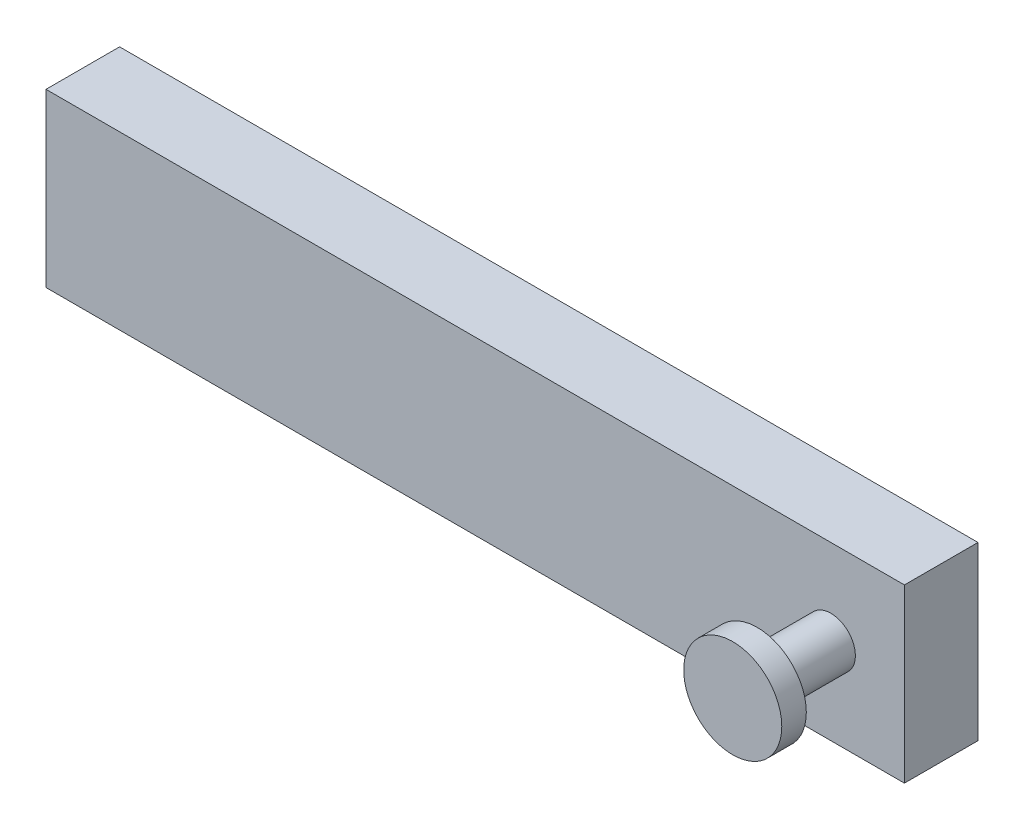
ISO-10303-21;
HEADER;
FILE_DESCRIPTION(('STEP AP214'),'2;1');
FILE_NAME('part.step','',(''),(''),'','','');
FILE_SCHEMA(('AUTOMOTIVE_DESIGN { 1 0 10303 214 1 1 1 1 }'));
ENDSEC;
DATA;
#1=APPLICATION_CONTEXT('core data for automotive mechanical design processes');
#2=APPLICATION_PROTOCOL_DEFINITION('international standard','automotive_design',2000,#1);
#3=PRODUCT_CONTEXT('',#1,'mechanical');
#4=PRODUCT('Part','Part','',(#3));
#5=PRODUCT_RELATED_PRODUCT_CATEGORY('part','',(#4));
#6=PRODUCT_DEFINITION_FORMATION('','',#4);
#7=PRODUCT_DEFINITION_CONTEXT('part definition',#1,'design');
#8=PRODUCT_DEFINITION('design','',#6,#7);
#9=PRODUCT_DEFINITION_SHAPE('','',#8);
#10=(LENGTH_UNIT() NAMED_UNIT(*) SI_UNIT(.MILLI.,.METRE.));
#11=(NAMED_UNIT(*) PLANE_ANGLE_UNIT() SI_UNIT($,.RADIAN.));
#12=(NAMED_UNIT(*) SI_UNIT($,.STERADIAN.) SOLID_ANGLE_UNIT());
#13=UNCERTAINTY_MEASURE_WITH_UNIT(LENGTH_MEASURE(1.E-05),#10,'distance_accuracy_value','');
#14=(GEOMETRIC_REPRESENTATION_CONTEXT(3) GLOBAL_UNCERTAINTY_ASSIGNED_CONTEXT((#13)) GLOBAL_UNIT_ASSIGNED_CONTEXT((#10,
#11,#12)) REPRESENTATION_CONTEXT('',''));
#15=CARTESIAN_POINT('',(0.,0.,0.));
#16=DIRECTION('',(0.,0.,1.));
#17=DIRECTION('',(1.,0.,0.));
#18=AXIS2_PLACEMENT_3D('',#15,#16,#17);
#19=CARTESIAN_POINT('',(0.,70.,30.));
#20=DIRECTION('',(0.,0.,-1.));
#21=DIRECTION('',(-1.,0.,0.));
#22=AXIS2_PLACEMENT_3D('',#19,#20,#21);
#23=PLANE('',#22);
#24=DIRECTION('',(0.,-1.,0.));
#25=VECTOR('',#24,1.);
#26=CARTESIAN_POINT('',(0.,0.,30.));
#27=LINE('',#26,#25);
#28=CARTESIAN_POINT('',(0.,70.,30.));
#29=VERTEX_POINT('',#28);
#30=CARTESIAN_POINT('',(0.,0.,30.));
#31=VERTEX_POINT('',#30);
#32=EDGE_CURVE('E83',#29,#31,#27,.T.);
#33=ORIENTED_EDGE('',*,*,#32,.T.);
#34=DIRECTION('',(1.,0.,0.));
#35=VECTOR('',#34,1.);
#36=CARTESIAN_POINT('',(0.,0.,30.));
#37=LINE('',#36,#35);
#38=CARTESIAN_POINT('',(350.,0.,30.));
#39=VERTEX_POINT('',#38);
#40=EDGE_CURVE('E78',#31,#39,#37,.T.);
#41=ORIENTED_EDGE('',*,*,#40,.T.);
#42=DIRECTION('',(0.,1.,0.));
#43=VECTOR('',#42,1.);
#44=CARTESIAN_POINT('',(350.,0.,30.));
#45=LINE('',#44,#43);
#46=CARTESIAN_POINT('',(350.,70.,30.));
#47=VERTEX_POINT('',#46);
#48=EDGE_CURVE('E81',#39,#47,#45,.T.);
#49=ORIENTED_EDGE('',*,*,#48,.T.);
#50=DIRECTION('',(-1.,0.,0.));
#51=VECTOR('',#50,1.);
#52=CARTESIAN_POINT('',(0.,70.,30.));
#53=LINE('',#52,#51);
#54=EDGE_CURVE('E48',#47,#29,#53,.T.);
#55=ORIENTED_EDGE('',*,*,#54,.T.);
#56=EDGE_LOOP('',(#33,#41,#49,#55));
#57=FACE_BOUND('',#56,.T.);
#58=CARTESIAN_POINT('',(320.,35.,30.));
#59=DIRECTION('',(0.,0.,1.));
#60=DIRECTION('',(1.,0.,0.));
#61=AXIS2_PLACEMENT_3D('',#58,#59,#60);
#62=CIRCLE('',#61,9.99999999999998);
#63=CARTESIAN_POINT('',(330.,35.,30.));
#64=VERTEX_POINT('',#63);
#65=EDGE_CURVE('E115',#64,#64,#62,.T.);
#66=ORIENTED_EDGE('',*,*,#65,.F.);
#67=EDGE_LOOP('',(#66));
#68=FACE_BOUND('',#67,.T.);
#69=ADVANCED_FACE('F31',(#57,#68),#23,.F.);
#70=CARTESIAN_POINT('',(0.,0.,30.));
#71=DIRECTION('',(1.,0.,0.));
#72=DIRECTION('',(0.,0.,-1.));
#73=AXIS2_PLACEMENT_3D('',#70,#71,#72);
#74=PLANE('',#73);
#75=DIRECTION('',(0.,-1.,0.));
#76=VECTOR('',#75,1.);
#77=CARTESIAN_POINT('',(0.,0.,0.));
#78=LINE('',#77,#76);
#79=CARTESIAN_POINT('',(0.,70.,0.));
#80=VERTEX_POINT('',#79);
#81=CARTESIAN_POINT('',(0.,0.,0.));
#82=VERTEX_POINT('',#81);
#83=EDGE_CURVE('E95',#80,#82,#78,.T.);
#84=ORIENTED_EDGE('',*,*,#83,.T.);
#85=DIRECTION('',(0.,0.,-1.));
#86=VECTOR('',#85,1.);
#87=CARTESIAN_POINT('',(0.,0.,30.));
#88=LINE('',#87,#86);
#89=EDGE_CURVE('E11',#31,#82,#88,.T.);
#90=ORIENTED_EDGE('',*,*,#89,.F.);
#91=ORIENTED_EDGE('',*,*,#32,.F.);
#92=DIRECTION('',(0.,0.,-1.));
#93=VECTOR('',#92,1.);
#94=CARTESIAN_POINT('',(0.,70.,30.));
#95=LINE('',#94,#93);
#96=EDGE_CURVE('E91',#29,#80,#95,.T.);
#97=ORIENTED_EDGE('',*,*,#96,.T.);
#98=EDGE_LOOP('',(#84,#90,#91,#97));
#99=FACE_BOUND('',#98,.T.);
#100=ADVANCED_FACE('F33',(#99),#74,.F.);
#101=CARTESIAN_POINT('',(0.,0.,30.));
#102=DIRECTION('',(0.,1.,0.));
#103=DIRECTION('',(0.,0.,1.));
#104=AXIS2_PLACEMENT_3D('',#101,#102,#103);
#105=PLANE('',#104);
#106=DIRECTION('',(1.,0.,0.));
#107=VECTOR('',#106,1.);
#108=CARTESIAN_POINT('',(0.,0.,0.));
#109=LINE('',#108,#107);
#110=CARTESIAN_POINT('',(350.,0.,0.));
#111=VERTEX_POINT('',#110);
#112=EDGE_CURVE('E87',#82,#111,#109,.T.);
#113=ORIENTED_EDGE('',*,*,#112,.T.);
#114=DIRECTION('',(0.,0.,-1.));
#115=VECTOR('',#114,1.);
#116=CARTESIAN_POINT('',(350.,0.,30.));
#117=LINE('',#116,#115);
#118=EDGE_CURVE('E40',#39,#111,#117,.T.);
#119=ORIENTED_EDGE('',*,*,#118,.F.);
#120=ORIENTED_EDGE('',*,*,#40,.F.);
#121=ORIENTED_EDGE('',*,*,#89,.T.);
#122=EDGE_LOOP('',(#113,#119,#120,#121));
#123=FACE_BOUND('',#122,.T.);
#124=ADVANCED_FACE('F86',(#123),#105,.F.);
#125=CARTESIAN_POINT('',(350.,0.,30.));
#126=DIRECTION('',(-1.,0.,0.));
#127=DIRECTION('',(0.,0.,1.));
#128=AXIS2_PLACEMENT_3D('',#125,#126,#127);
#129=PLANE('',#128);
#130=DIRECTION('',(0.,1.,0.));
#131=VECTOR('',#130,1.);
#132=CARTESIAN_POINT('',(350.,0.,0.));
#133=LINE('',#132,#131);
#134=CARTESIAN_POINT('',(350.,70.,0.));
#135=VERTEX_POINT('',#134);
#136=EDGE_CURVE('E65',#111,#135,#133,.T.);
#137=ORIENTED_EDGE('',*,*,#136,.T.);
#138=DIRECTION('',(0.,0.,-1.));
#139=VECTOR('',#138,1.);
#140=CARTESIAN_POINT('',(350.,70.,30.));
#141=LINE('',#140,#139);
#142=EDGE_CURVE('E88',#47,#135,#141,.T.);
#143=ORIENTED_EDGE('',*,*,#142,.F.);
#144=ORIENTED_EDGE('',*,*,#48,.F.);
#145=ORIENTED_EDGE('',*,*,#118,.T.);
#146=EDGE_LOOP('',(#137,#143,#144,#145));
#147=FACE_BOUND('',#146,.T.);
#148=ADVANCED_FACE('F89',(#147),#129,.F.);
#149=CARTESIAN_POINT('',(0.,70.,30.));
#150=DIRECTION('',(0.,-1.,0.));
#151=DIRECTION('',(0.,0.,-1.));
#152=AXIS2_PLACEMENT_3D('',#149,#150,#151);
#153=PLANE('',#152);
#154=DIRECTION('',(-1.,0.,0.));
#155=VECTOR('',#154,1.);
#156=CARTESIAN_POINT('',(0.,70.,0.));
#157=LINE('',#156,#155);
#158=EDGE_CURVE('E71',#135,#80,#157,.T.);
#159=ORIENTED_EDGE('',*,*,#158,.T.);
#160=ORIENTED_EDGE('',*,*,#96,.F.);
#161=ORIENTED_EDGE('',*,*,#54,.F.);
#162=ORIENTED_EDGE('',*,*,#142,.T.);
#163=EDGE_LOOP('',(#159,#160,#161,#162));
#164=FACE_BOUND('',#163,.T.);
#165=ADVANCED_FACE('F103',(#164),#153,.F.);
#166=CARTESIAN_POINT('',(0.,70.,0.));
#167=DIRECTION('',(0.,0.,-1.));
#168=DIRECTION('',(-1.,0.,0.));
#169=AXIS2_PLACEMENT_3D('',#166,#167,#168);
#170=PLANE('',#169);
#171=ORIENTED_EDGE('',*,*,#83,.F.);
#172=ORIENTED_EDGE('',*,*,#158,.F.);
#173=ORIENTED_EDGE('',*,*,#136,.F.);
#174=ORIENTED_EDGE('',*,*,#112,.F.);
#175=EDGE_LOOP('',(#171,#172,#173,#174));
#176=FACE_BOUND('',#175,.T.);
#177=ADVANCED_FACE('F106',(#176),#170,.T.);
#178=CARTESIAN_POINT('',(320.,35.,60.));
#179=DIRECTION('',(0.,0.,1.));
#180=DIRECTION('',(1.,0.,0.));
#181=AXIS2_PLACEMENT_3D('',#178,#179,#180);
#182=PLANE('',#181);
#183=CARTESIAN_POINT('',(320.,35.,60.));
#184=DIRECTION('',(0.,0.,1.));
#185=DIRECTION('',(1.,0.,0.));
#186=AXIS2_PLACEMENT_3D('',#183,#184,#185);
#187=CIRCLE('',#186,20.);
#188=CARTESIAN_POINT('',(340.,35.,60.));
#189=VERTEX_POINT('',#188);
#190=EDGE_CURVE('E111',#189,#189,#187,.T.);
#191=ORIENTED_EDGE('',*,*,#190,.F.);
#192=EDGE_LOOP('',(#191));
#193=FACE_BOUND('',#192,.T.);
#194=CARTESIAN_POINT('',(320.,35.,60.));
#195=DIRECTION('',(0.,0.,1.));
#196=DIRECTION('',(1.,0.,0.));
#197=AXIS2_PLACEMENT_3D('',#194,#195,#196);
#198=CIRCLE('',#197,9.99999999999998);
#199=CARTESIAN_POINT('',(330.,35.,60.));
#200=VERTEX_POINT('',#199);
#201=EDGE_CURVE('E114',#200,#200,#198,.T.);
#202=ORIENTED_EDGE('',*,*,#201,.T.);
#203=EDGE_LOOP('',(#202));
#204=FACE_BOUND('',#203,.T.);
#205=ADVANCED_FACE('F121',(#193,#204),#182,.F.);
#206=CARTESIAN_POINT('',(320.,35.,60.));
#207=DIRECTION('',(0.,0.,-1.));
#208=DIRECTION('',(-1.,0.,0.));
#209=AXIS2_PLACEMENT_3D('',#206,#207,#208);
#210=CYLINDRICAL_SURFACE('',#209,9.99999999999998);
#211=ORIENTED_EDGE('',*,*,#201,.F.);
#212=EDGE_LOOP('',(#211));
#213=FACE_BOUND('',#212,.T.);
#214=ORIENTED_EDGE('',*,*,#65,.T.);
#215=EDGE_LOOP('',(#214));
#216=FACE_BOUND('',#215,.T.);
#217=ADVANCED_FACE('F123',(#213,#216),#210,.T.);
#218=CARTESIAN_POINT('',(320.,35.,70.));
#219=DIRECTION('',(0.,0.,1.));
#220=DIRECTION('',(1.,0.,0.));
#221=AXIS2_PLACEMENT_3D('',#218,#219,#220);
#222=PLANE('',#221);
#223=CARTESIAN_POINT('',(320.,35.,70.));
#224=DIRECTION('',(0.,0.,1.));
#225=DIRECTION('',(1.,0.,0.));
#226=AXIS2_PLACEMENT_3D('',#223,#224,#225);
#227=CIRCLE('',#226,20.);
#228=CARTESIAN_POINT('',(340.,35.,70.));
#229=VERTEX_POINT('',#228);
#230=EDGE_CURVE('E98',#229,#229,#227,.T.);
#231=ORIENTED_EDGE('',*,*,#230,.T.);
#232=EDGE_LOOP('',(#231));
#233=FACE_BOUND('',#232,.T.);
#234=ADVANCED_FACE('F126',(#233),#222,.T.);
#235=CARTESIAN_POINT('',(320.,35.,70.));
#236=DIRECTION('',(0.,0.,-1.));
#237=DIRECTION('',(-1.,0.,0.));
#238=AXIS2_PLACEMENT_3D('',#235,#236,#237);
#239=CYLINDRICAL_SURFACE('',#238,20.);
#240=ORIENTED_EDGE('',*,*,#190,.T.);
#241=EDGE_LOOP('',(#240));
#242=FACE_BOUND('',#241,.T.);
#243=ORIENTED_EDGE('',*,*,#230,.F.);
#244=EDGE_LOOP('',(#243));
#245=FACE_BOUND('',#244,.T.);
#246=ADVANCED_FACE('F136',(#242,#245),#239,.T.);
#247=CLOSED_SHELL('',(#69,#100,#124,#148,#165,#177,#205,#217,#234,#246));
#248=MANIFOLD_SOLID_BREP('B2',#247);
#249=ADVANCED_BREP_SHAPE_REPRESENTATION('',(#18,#248),#14);
#250=SHAPE_DEFINITION_REPRESENTATION(#9,#249);
ENDSEC;
END-ISO-10303-21;
